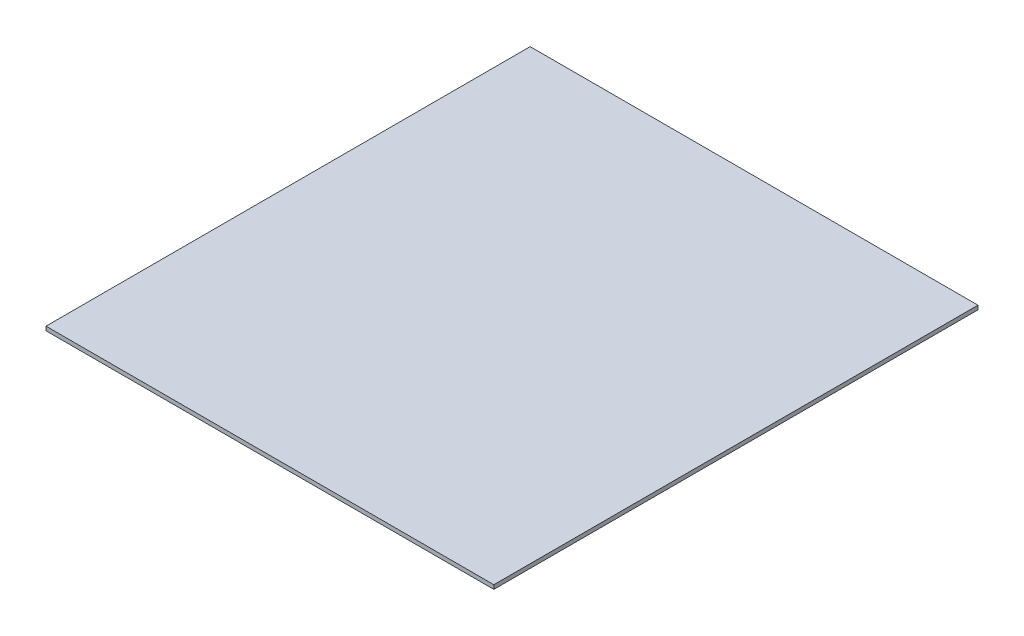
ISO-10303-21;
HEADER;
FILE_DESCRIPTION(('STEP AP214'),'2;1');
FILE_NAME('part.step','',(''),(''),'','','');
FILE_SCHEMA(('AUTOMOTIVE_DESIGN { 1 0 10303 214 1 1 1 1 }'));
ENDSEC;
DATA;
#1=APPLICATION_CONTEXT('core data for automotive mechanical design processes');
#2=APPLICATION_PROTOCOL_DEFINITION('international standard','automotive_design',2000,#1);
#3=PRODUCT_CONTEXT('',#1,'mechanical');
#4=PRODUCT('Part','Part','',(#3));
#5=PRODUCT_RELATED_PRODUCT_CATEGORY('part','',(#4));
#6=PRODUCT_DEFINITION_FORMATION('','',#4);
#7=PRODUCT_DEFINITION_CONTEXT('part definition',#1,'design');
#8=PRODUCT_DEFINITION('design','',#6,#7);
#9=PRODUCT_DEFINITION_SHAPE('','',#8);
#10=(LENGTH_UNIT() NAMED_UNIT(*) SI_UNIT(.MILLI.,.METRE.));
#11=(NAMED_UNIT(*) PLANE_ANGLE_UNIT() SI_UNIT($,.RADIAN.));
#12=(NAMED_UNIT(*) SI_UNIT($,.STERADIAN.) SOLID_ANGLE_UNIT());
#13=UNCERTAINTY_MEASURE_WITH_UNIT(LENGTH_MEASURE(1.E-05),#10,'distance_accuracy_value','');
#14=(GEOMETRIC_REPRESENTATION_CONTEXT(3) GLOBAL_UNCERTAINTY_ASSIGNED_CONTEXT((#13)) GLOBAL_UNIT_ASSIGNED_CONTEXT((#10,
#11,#12)) REPRESENTATION_CONTEXT('',''));
#15=CARTESIAN_POINT('',(0.,0.,0.));
#16=DIRECTION('',(0.,0.,1.));
#17=DIRECTION('',(1.,0.,0.));
#18=AXIS2_PLACEMENT_3D('',#15,#16,#17);
#19=CARTESIAN_POINT('',(555.,10.,-600.));
#20=DIRECTION('',(-1.,0.,0.));
#21=DIRECTION('',(0.,0.,1.));
#22=AXIS2_PLACEMENT_3D('',#19,#20,#21);
#23=PLANE('',#22);
#24=DIRECTION('',(0.,0.,-1.));
#25=VECTOR('',#24,1.);
#26=CARTESIAN_POINT('',(555.,0.,-600.));
#27=LINE('',#26,#25);
#28=CARTESIAN_POINT('',(555.,0.,600.));
#29=VERTEX_POINT('',#28);
#30=CARTESIAN_POINT('',(555.,0.,-600.));
#31=VERTEX_POINT('',#30);
#32=EDGE_CURVE('E96',#29,#31,#27,.T.);
#33=ORIENTED_EDGE('',*,*,#32,.T.);
#34=DIRECTION('',(0.,-1.,0.));
#35=VECTOR('',#34,1.);
#36=CARTESIAN_POINT('',(555.,10.,-600.));
#37=LINE('',#36,#35);
#38=CARTESIAN_POINT('',(555.,10.,-600.));
#39=VERTEX_POINT('',#38);
#40=EDGE_CURVE('E11',#39,#31,#37,.T.);
#41=ORIENTED_EDGE('',*,*,#40,.F.);
#42=DIRECTION('',(0.,0.,-1.));
#43=VECTOR('',#42,1.);
#44=CARTESIAN_POINT('',(555.,10.,-600.));
#45=LINE('',#44,#43);
#46=CARTESIAN_POINT('',(555.,10.,600.));
#47=VERTEX_POINT('',#46);
#48=EDGE_CURVE('E84',#47,#39,#45,.T.);
#49=ORIENTED_EDGE('',*,*,#48,.F.);
#50=DIRECTION('',(0.,-1.,0.));
#51=VECTOR('',#50,1.);
#52=CARTESIAN_POINT('',(555.,10.,600.));
#53=LINE('',#52,#51);
#54=EDGE_CURVE('E92',#47,#29,#53,.T.);
#55=ORIENTED_EDGE('',*,*,#54,.T.);
#56=EDGE_LOOP('',(#33,#41,#49,#55));
#57=FACE_BOUND('',#56,.T.);
#58=ADVANCED_FACE('F33',(#57),#23,.F.);
#59=CARTESIAN_POINT('',(-555.,10.,-600.));
#60=DIRECTION('',(0.,0.,1.));
#61=DIRECTION('',(1.,0.,0.));
#62=AXIS2_PLACEMENT_3D('',#59,#60,#61);
#63=PLANE('',#62);
#64=DIRECTION('',(-1.,0.,0.));
#65=VECTOR('',#64,1.);
#66=CARTESIAN_POINT('',(-555.,0.,-600.));
#67=LINE('',#66,#65);
#68=CARTESIAN_POINT('',(-555.,0.,-600.));
#69=VERTEX_POINT('',#68);
#70=EDGE_CURVE('E88',#31,#69,#67,.T.);
#71=ORIENTED_EDGE('',*,*,#70,.T.);
#72=DIRECTION('',(0.,-1.,0.));
#73=VECTOR('',#72,1.);
#74=CARTESIAN_POINT('',(-555.,10.,-600.));
#75=LINE('',#74,#73);
#76=CARTESIAN_POINT('',(-555.,10.,-600.));
#77=VERTEX_POINT('',#76);
#78=EDGE_CURVE('E41',#77,#69,#75,.T.);
#79=ORIENTED_EDGE('',*,*,#78,.F.);
#80=DIRECTION('',(-1.,0.,0.));
#81=VECTOR('',#80,1.);
#82=CARTESIAN_POINT('',(-555.,10.,-600.));
#83=LINE('',#82,#81);
#84=EDGE_CURVE('E79',#39,#77,#83,.T.);
#85=ORIENTED_EDGE('',*,*,#84,.F.);
#86=ORIENTED_EDGE('',*,*,#40,.T.);
#87=EDGE_LOOP('',(#71,#79,#85,#86));
#88=FACE_BOUND('',#87,.T.);
#89=ADVANCED_FACE('F87',(#88),#63,.F.);
#90=CARTESIAN_POINT('',(-555.,10.,-600.));
#91=DIRECTION('',(1.,0.,0.));
#92=DIRECTION('',(0.,0.,-1.));
#93=AXIS2_PLACEMENT_3D('',#90,#91,#92);
#94=PLANE('',#93);
#95=DIRECTION('',(0.,0.,1.));
#96=VECTOR('',#95,1.);
#97=CARTESIAN_POINT('',(-555.,0.,-600.));
#98=LINE('',#97,#96);
#99=CARTESIAN_POINT('',(-555.,0.,600.));
#100=VERTEX_POINT('',#99);
#101=EDGE_CURVE('E66',#69,#100,#98,.T.);
#102=ORIENTED_EDGE('',*,*,#101,.T.);
#103=DIRECTION('',(0.,-1.,0.));
#104=VECTOR('',#103,1.);
#105=CARTESIAN_POINT('',(-555.,10.,600.));
#106=LINE('',#105,#104);
#107=CARTESIAN_POINT('',(-555.,10.,600.));
#108=VERTEX_POINT('',#107);
#109=EDGE_CURVE('E89',#108,#100,#106,.T.);
#110=ORIENTED_EDGE('',*,*,#109,.F.);
#111=DIRECTION('',(0.,0.,1.));
#112=VECTOR('',#111,1.);
#113=CARTESIAN_POINT('',(-555.,10.,-600.));
#114=LINE('',#113,#112);
#115=EDGE_CURVE('E82',#77,#108,#114,.T.);
#116=ORIENTED_EDGE('',*,*,#115,.F.);
#117=ORIENTED_EDGE('',*,*,#78,.T.);
#118=EDGE_LOOP('',(#102,#110,#116,#117));
#119=FACE_BOUND('',#118,.T.);
#120=ADVANCED_FACE('F90',(#119),#94,.F.);
#121=CARTESIAN_POINT('',(-555.,10.,600.));
#122=DIRECTION('',(0.,0.,-1.));
#123=DIRECTION('',(-1.,0.,0.));
#124=AXIS2_PLACEMENT_3D('',#121,#122,#123);
#125=PLANE('',#124);
#126=DIRECTION('',(1.,0.,0.));
#127=VECTOR('',#126,1.);
#128=CARTESIAN_POINT('',(-555.,0.,600.));
#129=LINE('',#128,#127);
#130=EDGE_CURVE('E72',#100,#29,#129,.T.);
#131=ORIENTED_EDGE('',*,*,#130,.T.);
#132=ORIENTED_EDGE('',*,*,#54,.F.);
#133=DIRECTION('',(1.,0.,0.));
#134=VECTOR('',#133,1.);
#135=CARTESIAN_POINT('',(-555.,10.,600.));
#136=LINE('',#135,#134);
#137=EDGE_CURVE('E49',#108,#47,#136,.T.);
#138=ORIENTED_EDGE('',*,*,#137,.F.);
#139=ORIENTED_EDGE('',*,*,#109,.T.);
#140=EDGE_LOOP('',(#131,#132,#138,#139));
#141=FACE_BOUND('',#140,.T.);
#142=ADVANCED_FACE('F103',(#141),#125,.F.);
#143=CARTESIAN_POINT('',(0.,10.,0.));
#144=DIRECTION('',(0.,1.,0.));
#145=DIRECTION('',(0.,0.,1.));
#146=AXIS2_PLACEMENT_3D('',#143,#144,#145);
#147=PLANE('',#146);
#148=ORIENTED_EDGE('',*,*,#48,.T.);
#149=ORIENTED_EDGE('',*,*,#84,.T.);
#150=ORIENTED_EDGE('',*,*,#115,.T.);
#151=ORIENTED_EDGE('',*,*,#137,.T.);
#152=EDGE_LOOP('',(#148,#149,#150,#151));
#153=FACE_BOUND('',#152,.T.);
#154=ADVANCED_FACE('F80',(#153),#147,.T.);
#155=CARTESIAN_POINT('',(0.,0.,0.));
#156=DIRECTION('',(0.,1.,0.));
#157=DIRECTION('',(0.,0.,1.));
#158=AXIS2_PLACEMENT_3D('',#155,#156,#157);
#159=PLANE('',#158);
#160=ORIENTED_EDGE('',*,*,#32,.F.);
#161=ORIENTED_EDGE('',*,*,#130,.F.);
#162=ORIENTED_EDGE('',*,*,#101,.F.);
#163=ORIENTED_EDGE('',*,*,#70,.F.);
#164=EDGE_LOOP('',(#160,#161,#162,#163));
#165=FACE_BOUND('',#164,.T.);
#166=ADVANCED_FACE('F106',(#165),#159,.F.);
#167=CLOSED_SHELL('',(#58,#89,#120,#142,#154,#166));
#168=MANIFOLD_SOLID_BREP('B2',#167);
#169=ADVANCED_BREP_SHAPE_REPRESENTATION('',(#18,#168),#14);
#170=SHAPE_DEFINITION_REPRESENTATION(#9,#169);
ENDSEC;
END-ISO-10303-21;
